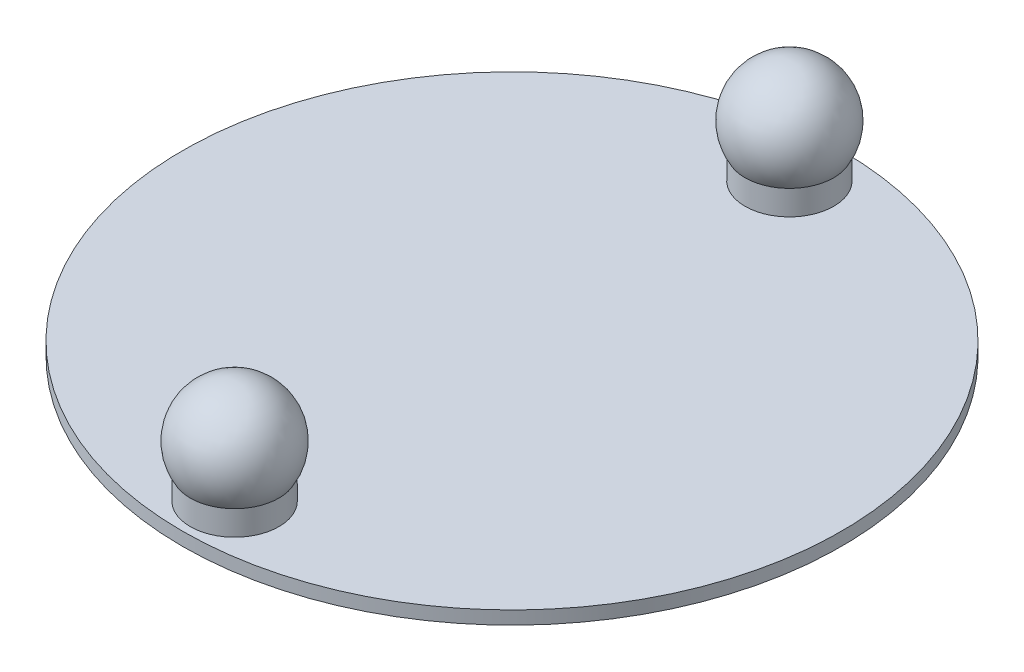
ISO-10303-21;
HEADER;
FILE_DESCRIPTION(('STEP AP214'),'2;1');
FILE_NAME('part.step','',(''),(''),'','','');
FILE_SCHEMA(('AUTOMOTIVE_DESIGN { 1 0 10303 214 1 1 1 1 }'));
ENDSEC;
DATA;
#1=APPLICATION_CONTEXT('core data for automotive mechanical design processes');
#2=APPLICATION_PROTOCOL_DEFINITION('international standard','automotive_design',2000,#1);
#3=PRODUCT_CONTEXT('',#1,'mechanical');
#4=PRODUCT('Part','Part','',(#3));
#5=PRODUCT_RELATED_PRODUCT_CATEGORY('part','',(#4));
#6=PRODUCT_DEFINITION_FORMATION('','',#4);
#7=PRODUCT_DEFINITION_CONTEXT('part definition',#1,'design');
#8=PRODUCT_DEFINITION('design','',#6,#7);
#9=PRODUCT_DEFINITION_SHAPE('','',#8);
#10=(LENGTH_UNIT() NAMED_UNIT(*) SI_UNIT(.MILLI.,.METRE.));
#11=(NAMED_UNIT(*) PLANE_ANGLE_UNIT() SI_UNIT($,.RADIAN.));
#12=(NAMED_UNIT(*) SI_UNIT($,.STERADIAN.) SOLID_ANGLE_UNIT());
#13=UNCERTAINTY_MEASURE_WITH_UNIT(LENGTH_MEASURE(1.E-05),#10,'distance_accuracy_value','');
#14=(GEOMETRIC_REPRESENTATION_CONTEXT(3) GLOBAL_UNCERTAINTY_ASSIGNED_CONTEXT((#13)) GLOBAL_UNIT_ASSIGNED_CONTEXT((#10,
#11,#12)) REPRESENTATION_CONTEXT('',''));
#15=CARTESIAN_POINT('',(0.,0.,0.));
#16=DIRECTION('',(0.,0.,1.));
#17=DIRECTION('',(1.,0.,0.));
#18=AXIS2_PLACEMENT_3D('',#15,#16,#17);
#19=CARTESIAN_POINT('',(0.,0.8,0.));
#20=DIRECTION('',(0.,-1.,0.));
#21=DIRECTION('',(0.,0.,-1.));
#22=AXIS2_PLACEMENT_3D('',#19,#20,#21);
#23=CYLINDRICAL_SURFACE('',#22,20.);
#24=CARTESIAN_POINT('',(0.,0.8,0.));
#25=DIRECTION('',(0.,1.,0.));
#26=DIRECTION('',(0.,0.,1.));
#27=AXIS2_PLACEMENT_3D('',#24,#25,#26);
#28=CIRCLE('',#27,20.);
#29=CARTESIAN_POINT('',(0.,0.8,20.));
#30=VERTEX_POINT('',#29);
#31=EDGE_CURVE('E44',#30,#30,#28,.T.);
#32=ORIENTED_EDGE('',*,*,#31,.F.);
#33=EDGE_LOOP('',(#32));
#34=FACE_BOUND('',#33,.T.);
#35=CARTESIAN_POINT('',(0.,0.,0.));
#36=DIRECTION('',(0.,1.,0.));
#37=DIRECTION('',(0.,0.,1.));
#38=AXIS2_PLACEMENT_3D('',#35,#36,#37);
#39=CIRCLE('',#38,20.);
#40=CARTESIAN_POINT('',(0.,0.,20.));
#41=VERTEX_POINT('',#40);
#42=EDGE_CURVE('E48',#41,#41,#39,.T.);
#43=ORIENTED_EDGE('',*,*,#42,.T.);
#44=EDGE_LOOP('',(#43));
#45=FACE_BOUND('',#44,.T.);
#46=ADVANCED_FACE('F34',(#34,#45),#23,.T.);
#47=CARTESIAN_POINT('',(0.,0.8,0.));
#48=DIRECTION('',(0.,1.,0.));
#49=DIRECTION('',(0.,0.,1.));
#50=AXIS2_PLACEMENT_3D('',#47,#48,#49);
#51=PLANE('',#50);
#52=CARTESIAN_POINT('',(0.,0.8,-16.835));
#53=DIRECTION('',(0.,1.,0.));
#54=DIRECTION('',(0.,0.,1.));
#55=AXIS2_PLACEMENT_3D('',#52,#53,#54);
#56=CIRCLE('',#55,2.69165376673896);
#57=CARTESIAN_POINT('',(0.,0.8,-14.143346233261));
#58=VERTEX_POINT('',#57);
#59=EDGE_CURVE('E10',#58,#58,#56,.T.);
#60=ORIENTED_EDGE('',*,*,#59,.F.);
#61=EDGE_LOOP('',(#60));
#62=FACE_BOUND('',#61,.T.);
#63=CARTESIAN_POINT('',(0.,0.8,16.835));
#64=DIRECTION('',(0.,1.,0.));
#65=DIRECTION('',(0.,0.,1.));
#66=AXIS2_PLACEMENT_3D('',#63,#64,#65);
#67=CIRCLE('',#66,2.69165376673896);
#68=CARTESIAN_POINT('',(0.,0.8,19.526653766739));
#69=VERTEX_POINT('',#68);
#70=EDGE_CURVE('E40',#69,#69,#67,.T.);
#71=ORIENTED_EDGE('',*,*,#70,.F.);
#72=EDGE_LOOP('',(#71));
#73=FACE_BOUND('',#72,.T.);
#74=ORIENTED_EDGE('',*,*,#31,.T.);
#75=EDGE_LOOP('',(#74));
#76=FACE_BOUND('',#75,.T.);
#77=ADVANCED_FACE('F74',(#62,#73,#76),#51,.T.);
#78=CARTESIAN_POINT('',(0.,0.,0.));
#79=DIRECTION('',(0.,1.,0.));
#80=DIRECTION('',(0.,0.,1.));
#81=AXIS2_PLACEMENT_3D('',#78,#79,#80);
#82=PLANE('',#81);
#83=ORIENTED_EDGE('',*,*,#42,.F.);
#84=EDGE_LOOP('',(#83));
#85=FACE_BOUND('',#84,.T.);
#86=ADVANCED_FACE('F79',(#85),#82,.F.);
#87=CARTESIAN_POINT('',(0.,3.96499999999999,16.835));
#88=DIRECTION('',(0.,1.,0.));
#89=DIRECTION('',(0.,0.,-1.));
#90=AXIS2_PLACEMENT_3D('',#87,#88,#89);
#91=SPHERICAL_SURFACE('',#90,3.165);
#92=CARTESIAN_POINT('',(0.,2.3,16.835));
#93=DIRECTION('',(0.,1.,0.));
#94=DIRECTION('',(0.,0.,1.));
#95=AXIS2_PLACEMENT_3D('',#92,#93,#94);
#96=CIRCLE('',#95,2.69165376673896);
#97=CARTESIAN_POINT('',(0.,2.3,19.526653766739));
#98=VERTEX_POINT('',#97);
#99=EDGE_CURVE('E52',#98,#98,#96,.T.);
#100=ORIENTED_EDGE('',*,*,#99,.T.);
#101=EDGE_LOOP('',(#100));
#102=FACE_BOUND('',#101,.T.);
#103=ADVANCED_FACE('F71',(#102),#91,.T.);
#104=CARTESIAN_POINT('',(0.,7.12999999999999,16.835));
#105=DIRECTION('',(0.,1.,0.));
#106=DIRECTION('',(0.,0.,1.));
#107=AXIS2_PLACEMENT_3D('',#104,#105,#106);
#108=CYLINDRICAL_SURFACE('',#107,2.69165376673896);
#109=ORIENTED_EDGE('',*,*,#70,.T.);
#110=EDGE_LOOP('',(#109));
#111=FACE_BOUND('',#110,.T.);
#112=ORIENTED_EDGE('',*,*,#99,.F.);
#113=EDGE_LOOP('',(#112));
#114=FACE_BOUND('',#113,.T.);
#115=ADVANCED_FACE('F64',(#111,#114),#108,.T.);
#116=CARTESIAN_POINT('',(0.,3.96499999999999,-16.835));
#117=DIRECTION('',(0.,1.,0.));
#118=DIRECTION('',(0.,0.,1.));
#119=AXIS2_PLACEMENT_3D('',#116,#117,#118);
#120=SPHERICAL_SURFACE('',#119,3.165);
#121=CARTESIAN_POINT('',(0.,2.3,-16.835));
#122=DIRECTION('',(0.,-1.,0.));
#123=DIRECTION('',(0.,0.,-1.));
#124=AXIS2_PLACEMENT_3D('',#121,#122,#123);
#125=CIRCLE('',#124,2.69165376673896);
#126=CARTESIAN_POINT('',(0.,2.3,-19.526653766739));
#127=VERTEX_POINT('',#126);
#128=EDGE_CURVE('E56',#127,#127,#125,.T.);
#129=ORIENTED_EDGE('',*,*,#128,.F.);
#130=EDGE_LOOP('',(#129));
#131=FACE_BOUND('',#130,.T.);
#132=ADVANCED_FACE('F62',(#131),#120,.T.);
#133=CARTESIAN_POINT('',(0.,7.12999999999999,-16.835));
#134=DIRECTION('',(0.,1.,0.));
#135=DIRECTION('',(0.,0.,-1.));
#136=AXIS2_PLACEMENT_3D('',#133,#134,#135);
#137=CYLINDRICAL_SURFACE('',#136,2.69165376673896);
#138=ORIENTED_EDGE('',*,*,#59,.T.);
#139=EDGE_LOOP('',(#138));
#140=FACE_BOUND('',#139,.T.);
#141=ORIENTED_EDGE('',*,*,#128,.T.);
#142=EDGE_LOOP('',(#141));
#143=FACE_BOUND('',#142,.T.);
#144=ADVANCED_FACE('F60',(#140,#143),#137,.T.);
#145=CLOSED_SHELL('',(#46,#77,#86,#103,#115,#132,#144));
#146=MANIFOLD_SOLID_BREP('B2',#145);
#147=ADVANCED_BREP_SHAPE_REPRESENTATION('',(#18,#146),#14);
#148=SHAPE_DEFINITION_REPRESENTATION(#9,#147);
ENDSEC;
END-ISO-10303-21;
